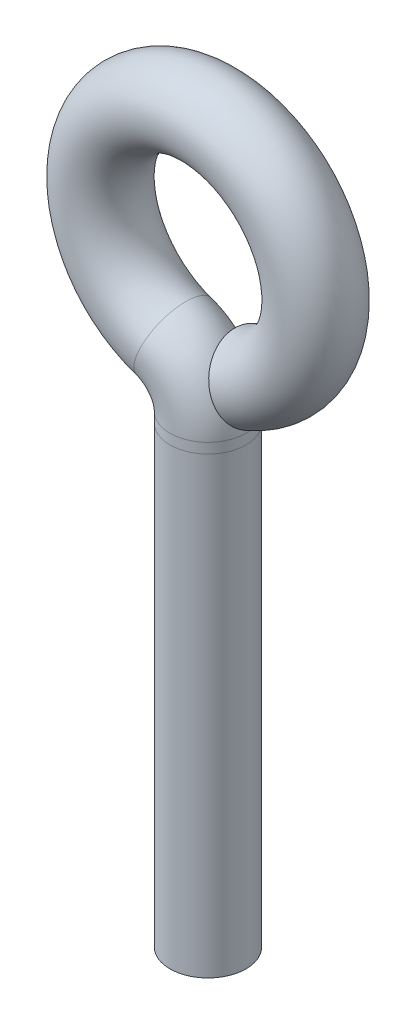
ISO-10303-21;
HEADER;
FILE_DESCRIPTION(('STEP AP214'),'2;1');
FILE_NAME('part.step','',(''),(''),'','','');
FILE_SCHEMA(('AUTOMOTIVE_DESIGN { 1 0 10303 214 1 1 1 1 }'));
ENDSEC;
DATA;
#1=APPLICATION_CONTEXT('core data for automotive mechanical design processes');
#2=APPLICATION_PROTOCOL_DEFINITION('international standard','automotive_design',2000,#1);
#3=PRODUCT_CONTEXT('',#1,'mechanical');
#4=PRODUCT('Part','Part','',(#3));
#5=PRODUCT_RELATED_PRODUCT_CATEGORY('part','',(#4));
#6=PRODUCT_DEFINITION_FORMATION('','',#4);
#7=PRODUCT_DEFINITION_CONTEXT('part definition',#1,'design');
#8=PRODUCT_DEFINITION('design','',#6,#7);
#9=PRODUCT_DEFINITION_SHAPE('','',#8);
#10=(LENGTH_UNIT() NAMED_UNIT(*) SI_UNIT(.MILLI.,.METRE.));
#11=(NAMED_UNIT(*) PLANE_ANGLE_UNIT() SI_UNIT($,.RADIAN.));
#12=(NAMED_UNIT(*) SI_UNIT($,.STERADIAN.) SOLID_ANGLE_UNIT());
#13=UNCERTAINTY_MEASURE_WITH_UNIT(LENGTH_MEASURE(1.E-05),#10,'distance_accuracy_value','');
#14=(GEOMETRIC_REPRESENTATION_CONTEXT(3) GLOBAL_UNCERTAINTY_ASSIGNED_CONTEXT((#13)) GLOBAL_UNIT_ASSIGNED_CONTEXT((#10,
#11,#12)) REPRESENTATION_CONTEXT('',''));
#15=CARTESIAN_POINT('',(0.,0.,0.));
#16=DIRECTION('',(0.,0.,1.));
#17=DIRECTION('',(1.,0.,0.));
#18=AXIS2_PLACEMENT_3D('',#15,#16,#17);
#19=CARTESIAN_POINT('',(1.6613110564319,20.6523796500699,0.));
#20=DIRECTION('',(0.9230246294419,0.384740865315401,0.));
#21=DIRECTION('',(-0.384740865315401,0.9230246294419,0.));
#22=AXIS2_PLACEMENT_3D('',#19,#20,#21);
#23=PLANE('',#22);
#24=CARTESIAN_POINT('',(1.6613110564319,20.6523796500699,0.));
#25=DIRECTION('',(0.9230246294419,0.384740865315401,0.));
#26=DIRECTION('',(-0.384740865315401,0.9230246294419,0.));
#27=AXIS2_PLACEMENT_3D('',#24,#25,#26);
#28=CIRCLE('',#27,1.524);
#29=CARTESIAN_POINT('',(2.24765613517256,19.2456901148004,0.));
#30=VERTEX_POINT('',#29);
#31=EDGE_CURVE('E62',#30,#30,#28,.T.);
#32=ORIENTED_EDGE('',*,*,#31,.F.);
#33=EDGE_LOOP('',(#32));
#34=FACE_BOUND('',#33,.T.);
#35=ADVANCED_FACE('F43',(#34),#23,.F.);
#36=CARTESIAN_POINT('',(0.,0.,0.));
#37=DIRECTION('',(0.,-1.,0.));
#38=DIRECTION('',(1.,0.,0.));
#39=AXIS2_PLACEMENT_3D('',#36,#37,#38);
#40=PLANE('',#39);
#41=CARTESIAN_POINT('',(0.,0.,0.));
#42=DIRECTION('',(0.,-1.,0.));
#43=DIRECTION('',(1.,0.,0.));
#44=AXIS2_PLACEMENT_3D('',#41,#42,#43);
#45=CIRCLE('',#44,1.524);
#46=CARTESIAN_POINT('',(1.524,0.,0.));
#47=VERTEX_POINT('',#46);
#48=EDGE_CURVE('E11',#47,#47,#45,.T.);
#49=ORIENTED_EDGE('',*,*,#48,.T.);
#50=EDGE_LOOP('',(#49));
#51=FACE_BOUND('',#50,.T.);
#52=ADVANCED_FACE('F69',(#51),#40,.T.);
#53=CARTESIAN_POINT('',(0.,24.638,0.));
#54=DIRECTION('',(0.,0.,1.));
#55=DIRECTION('',(1.,0.,0.));
#56=AXIS2_PLACEMENT_3D('',#53,#54,#55);
#57=TOROIDAL_SURFACE('',#56,4.318,1.524);
#58=CARTESIAN_POINT('',(-1.38176,20.547051051113,0.));
#59=DIRECTION('',(0.947417542586161,-0.319999999999999,0.));
#60=DIRECTION('',(0.319999999999999,0.947417542586161,0.));
#61=AXIS2_PLACEMENT_3D('',#58,#59,#60);
#62=CIRCLE('',#61,1.524);
#63=CARTESIAN_POINT('',(-1.86944,19.1031867162117,0.));
#64=VERTEX_POINT('',#63);
#65=EDGE_CURVE('E57',#64,#64,#62,.T.);
#66=CARTESIAN_POINT('',(0.,24.638,0.));
#67=DIRECTION('',(0.,0.,1.));
#68=DIRECTION('',(1.,0.,0.));
#69=AXIS2_PLACEMENT_3D('',#66,#67,#68);
#70=CIRCLE('',#69,5.842);
#71=EDGE_CURVE('',#30,#64,#70,.T.);
#72=ORIENTED_EDGE('',*,*,#31,.T.);
#73=ORIENTED_EDGE('',*,*,#65,.F.);
#74=ORIENTED_EDGE('',*,*,#71,.T.);
#75=ORIENTED_EDGE('',*,*,#71,.F.);
#76=EDGE_LOOP('',(#72,#74,#73,#75));
#77=FACE_BOUND('',#76,.T.);
#78=ADVANCED_FACE('F66',(#77),#57,.T.);
#79=CARTESIAN_POINT('',(-2.032,18.6218986045779,0.));
#80=DIRECTION('',(0.,0.,-1.));
#81=DIRECTION('',(-1.,0.,0.));
#82=AXIS2_PLACEMENT_3D('',#79,#80,#81);
#83=TOROIDAL_SURFACE('',#82,2.032,1.524);
#84=CARTESIAN_POINT('',(0.,18.6218986045779,0.));
#85=DIRECTION('',(0.,-1.,0.));
#86=DIRECTION('',(1.,0.,0.));
#87=AXIS2_PLACEMENT_3D('',#84,#85,#86);
#88=CIRCLE('',#87,1.524);
#89=CARTESIAN_POINT('',(1.524,18.6218986045779,0.));
#90=VERTEX_POINT('',#89);
#91=EDGE_CURVE('E53',#90,#90,#88,.T.);
#92=ORIENTED_EDGE('',*,*,#91,.F.);
#93=EDGE_LOOP('',(#92));
#94=FACE_BOUND('',#93,.T.);
#95=ORIENTED_EDGE('',*,*,#65,.T.);
#96=EDGE_LOOP('',(#95));
#97=FACE_BOUND('',#96,.T.);
#98=ADVANCED_FACE('F81',(#94,#97),#83,.T.);
#99=CARTESIAN_POINT('',(0.,18.6218986045779,0.));
#100=DIRECTION('',(0.,-1.,0.));
#101=DIRECTION('',(0.,0.,-1.));
#102=AXIS2_PLACEMENT_3D('',#99,#100,#101);
#103=CYLINDRICAL_SURFACE('',#102,1.524);
#104=CARTESIAN_POINT('',(0.,18.2150244653596,0.));
#105=DIRECTION('',(0.,-1.,0.));
#106=DIRECTION('',(1.,0.,0.));
#107=AXIS2_PLACEMENT_3D('',#104,#105,#106);
#108=CIRCLE('',#107,1.524);
#109=CARTESIAN_POINT('',(1.524,18.2150244653596,0.));
#110=VERTEX_POINT('',#109);
#111=EDGE_CURVE('E49',#110,#110,#108,.T.);
#112=ORIENTED_EDGE('',*,*,#111,.F.);
#113=EDGE_LOOP('',(#112));
#114=FACE_BOUND('',#113,.T.);
#115=ORIENTED_EDGE('',*,*,#91,.T.);
#116=EDGE_LOOP('',(#115));
#117=FACE_BOUND('',#116,.T.);
#118=ADVANCED_FACE('F75',(#114,#117),#103,.T.);
#119=CARTESIAN_POINT('',(0.,18.2150244653596,0.));
#120=DIRECTION('',(0.,-1.,0.));
#121=DIRECTION('',(0.,0.,-1.));
#122=AXIS2_PLACEMENT_3D('',#119,#120,#121);
#123=CYLINDRICAL_SURFACE('',#122,1.524);
#124=ORIENTED_EDGE('',*,*,#48,.F.);
#125=EDGE_LOOP('',(#124));
#126=FACE_BOUND('',#125,.T.);
#127=ORIENTED_EDGE('',*,*,#111,.T.);
#128=EDGE_LOOP('',(#127));
#129=FACE_BOUND('',#128,.T.);
#130=ADVANCED_FACE('F73',(#126,#129),#123,.T.);
#131=CLOSED_SHELL('',(#35,#52,#78,#98,#118,#130));
#132=MANIFOLD_SOLID_BREP('B2',#131);
#133=ADVANCED_BREP_SHAPE_REPRESENTATION('',(#18,#132),#14);
#134=SHAPE_DEFINITION_REPRESENTATION(#9,#133);
ENDSEC;
END-ISO-10303-21;
